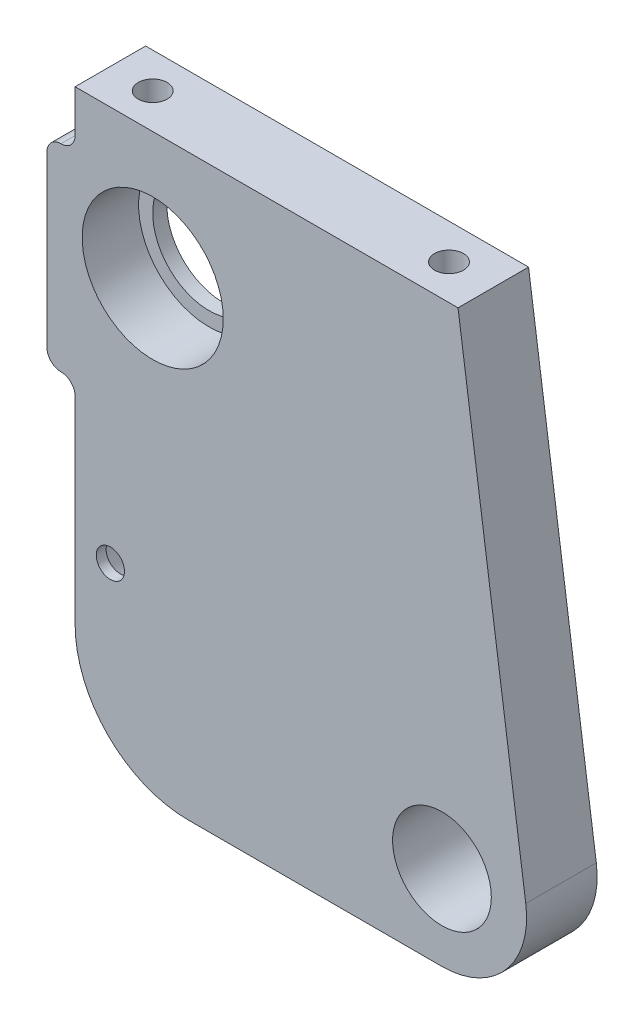
ISO-10303-21;
HEADER;
FILE_DESCRIPTION(('STEP AP214'),'2;1');
FILE_NAME('part.step','',(''),(''),'','','');
FILE_SCHEMA(('AUTOMOTIVE_DESIGN { 1 0 10303 214 1 1 1 1 }'));
ENDSEC;
DATA;
#1=APPLICATION_CONTEXT('core data for automotive mechanical design processes');
#2=APPLICATION_PROTOCOL_DEFINITION('international standard','automotive_design',2000,#1);
#3=PRODUCT_CONTEXT('',#1,'mechanical');
#4=PRODUCT('Part','Part','',(#3));
#5=PRODUCT_RELATED_PRODUCT_CATEGORY('part','',(#4));
#6=PRODUCT_DEFINITION_FORMATION('','',#4);
#7=PRODUCT_DEFINITION_CONTEXT('part definition',#1,'design');
#8=PRODUCT_DEFINITION('design','',#6,#7);
#9=PRODUCT_DEFINITION_SHAPE('','',#8);
#10=(LENGTH_UNIT() NAMED_UNIT(*) SI_UNIT(.MILLI.,.METRE.));
#11=(NAMED_UNIT(*) PLANE_ANGLE_UNIT() SI_UNIT($,.RADIAN.));
#12=(NAMED_UNIT(*) SI_UNIT($,.STERADIAN.) SOLID_ANGLE_UNIT());
#13=UNCERTAINTY_MEASURE_WITH_UNIT(LENGTH_MEASURE(1.E-05),#10,'distance_accuracy_value','');
#14=(GEOMETRIC_REPRESENTATION_CONTEXT(3) GLOBAL_UNCERTAINTY_ASSIGNED_CONTEXT((#13)) GLOBAL_UNIT_ASSIGNED_CONTEXT((#10,
#11,#12)) REPRESENTATION_CONTEXT('',''));
#15=CARTESIAN_POINT('',(0.,0.,0.));
#16=DIRECTION('',(0.,0.,1.));
#17=DIRECTION('',(1.,0.,0.));
#18=AXIS2_PLACEMENT_3D('',#15,#16,#17);
#19=CARTESIAN_POINT('',(-0.999999999999999,-17.,0.));
#20=DIRECTION('',(0.,0.,-1.));
#21=DIRECTION('',(-1.,0.,0.));
#22=AXIS2_PLACEMENT_3D('',#19,#20,#21);
#23=CYLINDRICAL_SURFACE('',#22,1.);
#24=DIRECTION('',(0.,0.,1.));
#25=VECTOR('',#24,1.);
#26=CARTESIAN_POINT('',(-0.999999999999998,-18.,0.));
#27=LINE('',#26,#25);
#28=CARTESIAN_POINT('',(-0.999999999999998,-18.,0.));
#29=VERTEX_POINT('',#28);
#30=CARTESIAN_POINT('',(-0.999999999999998,-18.,5.));
#31=VERTEX_POINT('',#30);
#32=EDGE_CURVE('E323',#29,#31,#27,.T.);
#33=ORIENTED_EDGE('',*,*,#32,.T.);
#34=CARTESIAN_POINT('',(-0.999999999999999,-17.,5.));
#35=DIRECTION('',(0.,0.,1.));
#36=DIRECTION('',(1.,0.,0.));
#37=AXIS2_PLACEMENT_3D('',#34,#35,#36);
#38=CIRCLE('',#37,1.);
#39=CARTESIAN_POINT('',(-2.,-17.,5.));
#40=VERTEX_POINT('',#39);
#41=EDGE_CURVE('E44',#40,#31,#38,.T.);
#42=ORIENTED_EDGE('',*,*,#41,.F.);
#43=DIRECTION('',(0.,0.,-1.));
#44=VECTOR('',#43,1.);
#45=CARTESIAN_POINT('',(-2.,-17.,0.));
#46=LINE('',#45,#44);
#47=CARTESIAN_POINT('',(-2.,-17.,0.));
#48=VERTEX_POINT('',#47);
#49=EDGE_CURVE('E346',#48,#40,#46,.F.);
#50=ORIENTED_EDGE('',*,*,#49,.F.);
#51=CARTESIAN_POINT('',(-0.999999999999999,-17.,0.));
#52=DIRECTION('',(0.,0.,1.));
#53=DIRECTION('',(1.,0.,0.));
#54=AXIS2_PLACEMENT_3D('',#51,#52,#53);
#55=CIRCLE('',#54,1.);
#56=EDGE_CURVE('E11',#29,#48,#55,.F.);
#57=ORIENTED_EDGE('',*,*,#56,.F.);
#58=EDGE_LOOP('',(#33,#42,#50,#57));
#59=FACE_BOUND('',#58,.T.);
#60=ADVANCED_FACE('F37',(#59),#23,.T.);
#61=CARTESIAN_POINT('',(-1.,-5.,0.));
#62=DIRECTION('',(0.,0.,1.));
#63=DIRECTION('',(1.,0.,0.));
#64=AXIS2_PLACEMENT_3D('',#61,#62,#63);
#65=CYLINDRICAL_SURFACE('',#64,1.);
#66=DIRECTION('',(0.,0.,1.));
#67=VECTOR('',#66,1.);
#68=CARTESIAN_POINT('',(-1.,-4.,0.));
#69=LINE('',#68,#67);
#70=CARTESIAN_POINT('',(-1.,-4.,5.));
#71=VERTEX_POINT('',#70);
#72=CARTESIAN_POINT('',(-1.,-4.,0.));
#73=VERTEX_POINT('',#72);
#74=EDGE_CURVE('E391',#71,#73,#69,.F.);
#75=ORIENTED_EDGE('',*,*,#74,.T.);
#76=CARTESIAN_POINT('',(-1.,-5.,0.));
#77=DIRECTION('',(0.,0.,1.));
#78=DIRECTION('',(1.,0.,0.));
#79=AXIS2_PLACEMENT_3D('',#76,#77,#78);
#80=CIRCLE('',#79,1.);
#81=CARTESIAN_POINT('',(-2.,-5.,0.));
#82=VERTEX_POINT('',#81);
#83=EDGE_CURVE('E342',#82,#73,#80,.F.);
#84=ORIENTED_EDGE('',*,*,#83,.F.);
#85=DIRECTION('',(0.,0.,1.));
#86=VECTOR('',#85,1.);
#87=CARTESIAN_POINT('',(-2.,-5.,0.));
#88=LINE('',#87,#86);
#89=CARTESIAN_POINT('',(-2.,-5.,5.));
#90=VERTEX_POINT('',#89);
#91=EDGE_CURVE('E339',#90,#82,#88,.F.);
#92=ORIENTED_EDGE('',*,*,#91,.F.);
#93=CARTESIAN_POINT('',(-1.,-5.,5.));
#94=DIRECTION('',(0.,0.,1.));
#95=DIRECTION('',(1.,0.,0.));
#96=AXIS2_PLACEMENT_3D('',#93,#94,#95);
#97=CIRCLE('',#96,1.);
#98=EDGE_CURVE('E344',#71,#90,#97,.T.);
#99=ORIENTED_EDGE('',*,*,#98,.F.);
#100=EDGE_LOOP('',(#75,#84,#92,#99));
#101=FACE_BOUND('',#100,.T.);
#102=ADVANCED_FACE('F316',(#101),#65,.T.);
#103=CARTESIAN_POINT('',(-0.999999999999998,-19.,0.));
#104=DIRECTION('',(0.,0.,1.));
#105=DIRECTION('',(1.,0.,0.));
#106=AXIS2_PLACEMENT_3D('',#103,#104,#105);
#107=CYLINDRICAL_SURFACE('',#106,1.);
#108=ORIENTED_EDGE('',*,*,#32,.F.);
#109=CARTESIAN_POINT('',(-0.999999999999998,-19.,0.));
#110=DIRECTION('',(0.,0.,1.));
#111=DIRECTION('',(1.,0.,0.));
#112=AXIS2_PLACEMENT_3D('',#109,#110,#111);
#113=CIRCLE('',#112,1.);
#114=CARTESIAN_POINT('',(0.,-19.,0.));
#115=VERTEX_POINT('',#114);
#116=EDGE_CURVE('E330',#29,#115,#113,.F.);
#117=ORIENTED_EDGE('',*,*,#116,.T.);
#118=DIRECTION('',(0.,0.,1.));
#119=VECTOR('',#118,1.);
#120=CARTESIAN_POINT('',(0.,-19.,5.));
#121=LINE('',#120,#119);
#122=CARTESIAN_POINT('',(0.,-19.,5.));
#123=VERTEX_POINT('',#122);
#124=EDGE_CURVE('E326',#123,#115,#121,.F.);
#125=ORIENTED_EDGE('',*,*,#124,.F.);
#126=CARTESIAN_POINT('',(-0.999999999999998,-19.,5.));
#127=DIRECTION('',(0.,0.,1.));
#128=DIRECTION('',(1.,0.,0.));
#129=AXIS2_PLACEMENT_3D('',#126,#127,#128);
#130=CIRCLE('',#129,1.);
#131=EDGE_CURVE('E337',#123,#31,#130,.T.);
#132=ORIENTED_EDGE('',*,*,#131,.T.);
#133=EDGE_LOOP('',(#108,#117,#125,#132));
#134=FACE_BOUND('',#133,.T.);
#135=ADVANCED_FACE('F320',(#134),#107,.F.);
#136=CARTESIAN_POINT('',(-1.,-3.,5.));
#137=DIRECTION('',(0.,0.,1.));
#138=DIRECTION('',(1.,0.,0.));
#139=AXIS2_PLACEMENT_3D('',#136,#137,#138);
#140=CYLINDRICAL_SURFACE('',#139,1.);
#141=DIRECTION('',(0.,0.,1.));
#142=VECTOR('',#141,1.);
#143=CARTESIAN_POINT('',(0.,-3.,5.));
#144=LINE('',#143,#142);
#145=CARTESIAN_POINT('',(0.,-3.,0.));
#146=VERTEX_POINT('',#145);
#147=CARTESIAN_POINT('',(0.,-3.,5.));
#148=VERTEX_POINT('',#147);
#149=EDGE_CURVE('E272',#146,#148,#144,.T.);
#150=ORIENTED_EDGE('',*,*,#149,.F.);
#151=CARTESIAN_POINT('',(-1.,-3.,0.));
#152=DIRECTION('',(0.,0.,1.));
#153=DIRECTION('',(1.,0.,0.));
#154=AXIS2_PLACEMENT_3D('',#151,#152,#153);
#155=CIRCLE('',#154,1.);
#156=EDGE_CURVE('E332',#146,#73,#155,.F.);
#157=ORIENTED_EDGE('',*,*,#156,.T.);
#158=ORIENTED_EDGE('',*,*,#74,.F.);
#159=CARTESIAN_POINT('',(-1.,-3.,5.));
#160=DIRECTION('',(0.,0.,1.));
#161=DIRECTION('',(1.,0.,0.));
#162=AXIS2_PLACEMENT_3D('',#159,#160,#161);
#163=CIRCLE('',#162,1.);
#164=EDGE_CURVE('E327',#71,#148,#163,.T.);
#165=ORIENTED_EDGE('',*,*,#164,.T.);
#166=EDGE_LOOP('',(#150,#157,#158,#165));
#167=FACE_BOUND('',#166,.T.);
#168=ADVANCED_FACE('F392',(#167),#140,.F.);
#169=CARTESIAN_POINT('',(0.,0.,5.));
#170=DIRECTION('',(1.,0.,0.));
#171=DIRECTION('',(0.,1.,0.));
#172=AXIS2_PLACEMENT_3D('',#169,#170,#171);
#173=PLANE('',#172);
#174=DIRECTION('',(0.,-1.,0.));
#175=VECTOR('',#174,1.);
#176=CARTESIAN_POINT('',(0.,0.,5.));
#177=LINE('',#176,#175);
#178=CARTESIAN_POINT('',(0.,-33.0000000000001,5.));
#179=VERTEX_POINT('',#178);
#180=EDGE_CURVE('E245',#123,#179,#177,.T.);
#181=ORIENTED_EDGE('',*,*,#180,.F.);
#182=ORIENTED_EDGE('',*,*,#124,.T.);
#183=DIRECTION('',(0.,-1.,0.));
#184=VECTOR('',#183,1.);
#185=CARTESIAN_POINT('',(0.,0.,0.));
#186=LINE('',#185,#184);
#187=CARTESIAN_POINT('',(0.,-33.0000000000001,0.));
#188=VERTEX_POINT('',#187);
#189=EDGE_CURVE('E240',#115,#188,#186,.T.);
#190=ORIENTED_EDGE('',*,*,#189,.T.);
#191=DIRECTION('',(0.,0.,-1.));
#192=VECTOR('',#191,1.);
#193=CARTESIAN_POINT('',(0.,-33.0000000000001,5.));
#194=LINE('',#193,#192);
#195=EDGE_CURVE('E267',#188,#179,#194,.F.);
#196=ORIENTED_EDGE('',*,*,#195,.T.);
#197=EDGE_LOOP('',(#181,#182,#190,#196));
#198=FACE_BOUND('',#197,.T.);
#199=ADVANCED_FACE('F357',(#198),#173,.F.);
#200=CARTESIAN_POINT('',(0.,0.,0.));
#201=VERTEX_POINT('',#200);
#202=EDGE_CURVE('E251',#201,#146,#186,.T.);
#203=ORIENTED_EDGE('',*,*,#202,.T.);
#204=ORIENTED_EDGE('',*,*,#149,.T.);
#205=CARTESIAN_POINT('',(0.,0.,5.));
#206=VERTEX_POINT('',#205);
#207=EDGE_CURVE('E241',#206,#148,#177,.T.);
#208=ORIENTED_EDGE('',*,*,#207,.F.);
#209=DIRECTION('',(0.,0.,-1.));
#210=VECTOR('',#209,1.);
#211=CARTESIAN_POINT('',(0.,0.,5.));
#212=LINE('',#211,#210);
#213=EDGE_CURVE('E250',#206,#201,#212,.T.);
#214=ORIENTED_EDGE('',*,*,#213,.T.);
#215=EDGE_LOOP('',(#203,#204,#208,#214));
#216=FACE_BOUND('',#215,.T.);
#217=ADVANCED_FACE('F383',(#216),#173,.F.);
#218=CARTESIAN_POINT('',(2.5,-28.,7.8284271247462));
#219=DIRECTION('',(0.,0.,-1.));
#220=DIRECTION('',(-1.,0.,0.));
#221=AXIS2_PLACEMENT_3D('',#218,#219,#220);
#222=CYLINDRICAL_SURFACE('',#221,1.);
#223=CARTESIAN_POINT('',(2.5,-28.,5.));
#224=DIRECTION('',(0.,0.,1.));
#225=DIRECTION('',(1.,0.,0.));
#226=AXIS2_PLACEMENT_3D('',#223,#224,#225);
#227=CIRCLE('',#226,1.);
#228=CARTESIAN_POINT('',(3.5,-28.,5.));
#229=VERTEX_POINT('',#228);
#230=EDGE_CURVE('E190',#229,#229,#227,.F.);
#231=ORIENTED_EDGE('',*,*,#230,.F.);
#232=EDGE_LOOP('',(#231));
#233=FACE_BOUND('',#232,.T.);
#234=CARTESIAN_POINT('',(2.5,-28.,4.3));
#235=DIRECTION('',(0.,0.,-1.));
#236=DIRECTION('',(-1.,0.,0.));
#237=AXIS2_PLACEMENT_3D('',#234,#235,#236);
#238=CIRCLE('',#237,1.);
#239=CARTESIAN_POINT('',(1.5,-28.,4.3));
#240=VERTEX_POINT('',#239);
#241=EDGE_CURVE('E182',#240,#240,#238,.F.);
#242=ORIENTED_EDGE('',*,*,#241,.F.);
#243=EDGE_LOOP('',(#242));
#244=FACE_BOUND('',#243,.T.);
#245=ADVANCED_FACE('F430',(#233,#244),#222,.F.);
#246=CARTESIAN_POINT('',(5.5,-9.00000000000013,-11.3137084989848));
#247=DIRECTION('',(0.,0.,1.));
#248=DIRECTION('',(1.,0.,0.));
#249=AXIS2_PLACEMENT_3D('',#246,#247,#248);
#250=CYLINDRICAL_SURFACE('',#249,4.);
#251=CARTESIAN_POINT('',(5.5,-9.00000000000013,0.));
#252=DIRECTION('',(0.,0.,1.));
#253=DIRECTION('',(1.,0.,0.));
#254=AXIS2_PLACEMENT_3D('',#251,#252,#253);
#255=CIRCLE('',#254,4.);
#256=CARTESIAN_POINT('',(9.5,-9.00000000000013,0.));
#257=VERTEX_POINT('',#256);
#258=EDGE_CURVE('E231',#257,#257,#255,.F.);
#259=ORIENTED_EDGE('',*,*,#258,.T.);
#260=EDGE_LOOP('',(#259));
#261=FACE_BOUND('',#260,.T.);
#262=CARTESIAN_POINT('',(5.5,-9.00000000000013,1.));
#263=DIRECTION('',(0.,0.,1.));
#264=DIRECTION('',(1.,0.,0.));
#265=AXIS2_PLACEMENT_3D('',#262,#263,#264);
#266=CIRCLE('',#265,4.);
#267=CARTESIAN_POINT('',(9.5,-9.00000000000013,1.));
#268=VERTEX_POINT('',#267);
#269=EDGE_CURVE('E228',#268,#268,#266,.F.);
#270=ORIENTED_EDGE('',*,*,#269,.F.);
#271=EDGE_LOOP('',(#270));
#272=FACE_BOUND('',#271,.T.);
#273=ADVANCED_FACE('F432',(#261,#272),#250,.F.);
#274=CARTESIAN_POINT('',(0.,-41.0000000000001,5.));
#275=DIRECTION('',(0.,1.,0.));
#276=DIRECTION('',(-1.,0.,0.));
#277=AXIS2_PLACEMENT_3D('',#274,#275,#276);
#278=PLANE('',#277);
#279=DIRECTION('',(1.,0.,0.));
#280=VECTOR('',#279,1.);
#281=CARTESIAN_POINT('',(0.,-41.0000000000001,0.));
#282=LINE('',#281,#280);
#283=CARTESIAN_POINT('',(8.00000000000004,-41.0000000000001,0.));
#284=VERTEX_POINT('',#283);
#285=CARTESIAN_POINT('',(26.,-41.0000000000001,0.));
#286=VERTEX_POINT('',#285);
#287=EDGE_CURVE('E254',#284,#286,#282,.T.);
#288=ORIENTED_EDGE('',*,*,#287,.T.);
#289=DIRECTION('',(0.,0.,-1.));
#290=VECTOR('',#289,1.);
#291=CARTESIAN_POINT('',(26.,-41.0000000000001,46.773197148411));
#292=LINE('',#291,#290);
#293=CARTESIAN_POINT('',(26.,-41.0000000000001,5.));
#294=VERTEX_POINT('',#293);
#295=EDGE_CURVE('E199',#294,#286,#292,.T.);
#296=ORIENTED_EDGE('',*,*,#295,.F.);
#297=DIRECTION('',(1.,0.,0.));
#298=VECTOR('',#297,1.);
#299=CARTESIAN_POINT('',(0.,-41.0000000000001,5.));
#300=LINE('',#299,#298);
#301=CARTESIAN_POINT('',(8.00000000000004,-41.0000000000001,5.));
#302=VERTEX_POINT('',#301);
#303=EDGE_CURVE('E244',#302,#294,#300,.T.);
#304=ORIENTED_EDGE('',*,*,#303,.F.);
#305=DIRECTION('',(0.,0.,-1.));
#306=VECTOR('',#305,1.);
#307=CARTESIAN_POINT('',(8.00000000000004,-41.0000000000001,5.));
#308=LINE('',#307,#306);
#309=EDGE_CURVE('E261',#302,#284,#308,.T.);
#310=ORIENTED_EDGE('',*,*,#309,.T.);
#311=EDGE_LOOP('',(#288,#296,#304,#310));
#312=FACE_BOUND('',#311,.T.);
#313=ADVANCED_FACE('F365',(#312),#278,.F.);
#314=CARTESIAN_POINT('',(0.,0.,5.));
#315=DIRECTION('',(0.,-1.,0.));
#316=DIRECTION('',(0.,0.,-1.));
#317=AXIS2_PLACEMENT_3D('',#314,#315,#316);
#318=PLANE('',#317);
#319=CARTESIAN_POINT('',(3.,0.,2.5));
#320=DIRECTION('',(0.,1.,0.));
#321=DIRECTION('',(0.,0.,1.));
#322=AXIS2_PLACEMENT_3D('',#319,#320,#321);
#323=CIRCLE('',#322,1.025);
#324=CARTESIAN_POINT('',(3.,0.,3.525));
#325=VERTEX_POINT('',#324);
#326=EDGE_CURVE('E211',#325,#325,#323,.T.);
#327=ORIENTED_EDGE('',*,*,#326,.F.);
#328=EDGE_LOOP('',(#327));
#329=FACE_BOUND('',#328,.T.);
#330=CARTESIAN_POINT('',(24.,0.,2.5));
#331=DIRECTION('',(0.,1.,0.));
#332=DIRECTION('',(0.,0.,1.));
#333=AXIS2_PLACEMENT_3D('',#330,#331,#332);
#334=CIRCLE('',#333,1.025);
#335=CARTESIAN_POINT('',(24.,0.,3.525));
#336=VERTEX_POINT('',#335);
#337=EDGE_CURVE('E218',#336,#336,#334,.T.);
#338=ORIENTED_EDGE('',*,*,#337,.F.);
#339=EDGE_LOOP('',(#338));
#340=FACE_BOUND('',#339,.T.);
#341=DIRECTION('',(-1.,0.,0.));
#342=VECTOR('',#341,1.);
#343=CARTESIAN_POINT('',(0.,0.,5.));
#344=LINE('',#343,#342);
#345=CARTESIAN_POINT('',(27.140036220528,0.,5.));
#346=VERTEX_POINT('',#345);
#347=EDGE_CURVE('E248',#346,#206,#344,.T.);
#348=ORIENTED_EDGE('',*,*,#347,.F.);
#349=DIRECTION('',(0.,0.,-1.));
#350=VECTOR('',#349,1.);
#351=CARTESIAN_POINT('',(27.140036220528,0.,46.773197148411));
#352=LINE('',#351,#350);
#353=CARTESIAN_POINT('',(27.140036220528,0.,0.));
#354=VERTEX_POINT('',#353);
#355=EDGE_CURVE('E204',#346,#354,#352,.T.);
#356=ORIENTED_EDGE('',*,*,#355,.T.);
#357=DIRECTION('',(-1.,0.,0.));
#358=VECTOR('',#357,1.);
#359=CARTESIAN_POINT('',(0.,0.,0.));
#360=LINE('',#359,#358);
#361=EDGE_CURVE('E257',#354,#201,#360,.T.);
#362=ORIENTED_EDGE('',*,*,#361,.T.);
#363=ORIENTED_EDGE('',*,*,#213,.F.);
#364=EDGE_LOOP('',(#348,#356,#362,#363));
#365=FACE_BOUND('',#364,.T.);
#366=ADVANCED_FACE('F378',(#329,#340,#365),#318,.F.);
#367=CARTESIAN_POINT('',(0.,-41.0000000000001,5.));
#368=DIRECTION('',(0.,0.,1.));
#369=DIRECTION('',(1.,0.,0.));
#370=AXIS2_PLACEMENT_3D('',#367,#368,#369);
#371=PLANE('',#370);
#372=DIRECTION('',(0.,-1.,0.));
#373=VECTOR('',#372,1.);
#374=CARTESIAN_POINT('',(-2.,-4.,5.));
#375=LINE('',#374,#373);
#376=EDGE_CURVE('E353',#90,#40,#375,.T.);
#377=ORIENTED_EDGE('',*,*,#376,.T.);
#378=ORIENTED_EDGE('',*,*,#41,.T.);
#379=ORIENTED_EDGE('',*,*,#131,.F.);
#380=ORIENTED_EDGE('',*,*,#180,.T.);
#381=CARTESIAN_POINT('',(8.,-33.0000000000001,5.));
#382=DIRECTION('',(0.,0.,1.));
#383=DIRECTION('',(1.,0.,0.));
#384=AXIS2_PLACEMENT_3D('',#381,#382,#383);
#385=CIRCLE('',#384,8.);
#386=EDGE_CURVE('E270',#179,#302,#385,.T.);
#387=ORIENTED_EDGE('',*,*,#386,.T.);
#388=ORIENTED_EDGE('',*,*,#303,.T.);
#389=CARTESIAN_POINT('',(26.,-35.0000000000001,5.));
#390=DIRECTION('',(0.,0.,1.));
#391=DIRECTION('',(1.,0.,0.));
#392=AXIS2_PLACEMENT_3D('',#389,#390,#391);
#393=CIRCLE('',#392,6.00000000000001);
#394=CARTESIAN_POINT('',(31.9416084124494,-34.1649613942397,5.));
#395=VERTEX_POINT('',#394);
#396=EDGE_CURVE('E206',#294,#395,#393,.T.);
#397=ORIENTED_EDGE('',*,*,#396,.T.);
#398=DIRECTION('',(-0.139173100960065,0.99026806874157,0.));
#399=VECTOR('',#398,1.);
#400=CARTESIAN_POINT('',(31.9416084124494,-34.1649613942397,5.));
#401=LINE('',#400,#399);
#402=EDGE_CURVE('E201',#395,#346,#401,.T.);
#403=ORIENTED_EDGE('',*,*,#402,.T.);
#404=ORIENTED_EDGE('',*,*,#347,.T.);
#405=ORIENTED_EDGE('',*,*,#207,.T.);
#406=ORIENTED_EDGE('',*,*,#164,.F.);
#407=ORIENTED_EDGE('',*,*,#98,.T.);
#408=EDGE_LOOP('',(#377,#378,#379,#380,#387,#388,#397,#403,#404,#405,#406,#407));
#409=FACE_BOUND('',#408,.T.);
#410=ORIENTED_EDGE('',*,*,#230,.T.);
#411=EDGE_LOOP('',(#410));
#412=FACE_BOUND('',#411,.T.);
#413=CARTESIAN_POINT('',(5.5,-9.00000000000013,5.));
#414=DIRECTION('',(0.,0.,1.));
#415=DIRECTION('',(1.,0.,0.));
#416=AXIS2_PLACEMENT_3D('',#413,#414,#415);
#417=CIRCLE('',#416,5.);
#418=CARTESIAN_POINT('',(10.5,-9.00000000000013,5.));
#419=VERTEX_POINT('',#418);
#420=EDGE_CURVE('E224',#419,#419,#417,.T.);
#421=ORIENTED_EDGE('',*,*,#420,.F.);
#422=EDGE_LOOP('',(#421));
#423=FACE_BOUND('',#422,.T.);
#424=CARTESIAN_POINT('',(26.,-35.0000000000001,5.));
#425=DIRECTION('',(0.,0.,1.));
#426=DIRECTION('',(1.,0.,0.));
#427=AXIS2_PLACEMENT_3D('',#424,#425,#426);
#428=CIRCLE('',#427,3.5);
#429=CARTESIAN_POINT('',(29.5,-35.0000000000001,5.));
#430=VERTEX_POINT('',#429);
#431=EDGE_CURVE('E234',#430,#430,#428,.T.);
#432=ORIENTED_EDGE('',*,*,#431,.F.);
#433=EDGE_LOOP('',(#432));
#434=FACE_BOUND('',#433,.T.);
#435=ADVANCED_FACE('F349',(#409,#412,#423,#434),#371,.T.);
#436=CARTESIAN_POINT('',(0.,-41.0000000000001,0.));
#437=DIRECTION('',(0.,0.,1.));
#438=DIRECTION('',(1.,0.,0.));
#439=AXIS2_PLACEMENT_3D('',#436,#437,#438);
#440=PLANE('',#439);
#441=DIRECTION('',(0.,1.,0.));
#442=VECTOR('',#441,1.);
#443=CARTESIAN_POINT('',(0.49999999999911,-22.1,0.));
#444=LINE('',#443,#442);
#445=CARTESIAN_POINT('',(0.499999999999109,-31.099737485718,0.));
#446=VERTEX_POINT('',#445);
#447=CARTESIAN_POINT('',(0.49999999999911,-22.1,0.));
#448=VERTEX_POINT('',#447);
#449=EDGE_CURVE('E166',#446,#448,#444,.T.);
#450=ORIENTED_EDGE('',*,*,#449,.F.);
#451=DIRECTION('',(-1.,0.,0.));
#452=VECTOR('',#451,1.);
#453=CARTESIAN_POINT('',(7.09999999999916,-31.099737485718,0.));
#454=LINE('',#453,#452);
#455=CARTESIAN_POINT('',(7.49999999999919,-31.099737485718,0.));
#456=VERTEX_POINT('',#455);
#457=EDGE_CURVE('E160',#456,#446,#454,.T.);
#458=ORIENTED_EDGE('',*,*,#457,.F.);
#459=DIRECTION('',(0.,-1.,0.));
#460=VECTOR('',#459,1.);
#461=CARTESIAN_POINT('',(7.49999999999919,-31.099737485718,0.));
#462=LINE('',#461,#460);
#463=CARTESIAN_POINT('',(7.4999999999991,-22.1,0.));
#464=VERTEX_POINT('',#463);
#465=EDGE_CURVE('E184',#464,#456,#462,.T.);
#466=ORIENTED_EDGE('',*,*,#465,.F.);
#467=DIRECTION('',(1.,0.,0.));
#468=VECTOR('',#467,1.);
#469=CARTESIAN_POINT('',(7.4999999999991,-22.1,0.));
#470=LINE('',#469,#468);
#471=EDGE_CURVE('E181',#448,#464,#470,.T.);
#472=ORIENTED_EDGE('',*,*,#471,.F.);
#473=EDGE_LOOP('',(#450,#458,#466,#472));
#474=FACE_BOUND('',#473,.T.);
#475=ORIENTED_EDGE('',*,*,#258,.F.);
#476=EDGE_LOOP('',(#475));
#477=FACE_BOUND('',#476,.T.);
#478=CARTESIAN_POINT('',(26.,-35.0000000000001,0.));
#479=DIRECTION('',(0.,0.,1.));
#480=DIRECTION('',(1.,0.,0.));
#481=AXIS2_PLACEMENT_3D('',#478,#479,#480);
#482=CIRCLE('',#481,3.5);
#483=CARTESIAN_POINT('',(29.5,-35.0000000000001,0.));
#484=VERTEX_POINT('',#483);
#485=EDGE_CURVE('E237',#484,#484,#482,.F.);
#486=ORIENTED_EDGE('',*,*,#485,.F.);
#487=EDGE_LOOP('',(#486));
#488=FACE_BOUND('',#487,.T.);
#489=ORIENTED_EDGE('',*,*,#116,.F.);
#490=ORIENTED_EDGE('',*,*,#56,.T.);
#491=DIRECTION('',(0.,-1.,0.));
#492=VECTOR('',#491,1.);
#493=CARTESIAN_POINT('',(-2.,-4.,0.));
#494=LINE('',#493,#492);
#495=EDGE_CURVE('E397',#82,#48,#494,.T.);
#496=ORIENTED_EDGE('',*,*,#495,.F.);
#497=ORIENTED_EDGE('',*,*,#83,.T.);
#498=ORIENTED_EDGE('',*,*,#156,.F.);
#499=ORIENTED_EDGE('',*,*,#202,.F.);
#500=ORIENTED_EDGE('',*,*,#361,.F.);
#501=DIRECTION('',(-0.139173100960065,0.99026806874157,0.));
#502=VECTOR('',#501,1.);
#503=CARTESIAN_POINT('',(31.9416084124494,-34.1649613942397,0.));
#504=LINE('',#503,#502);
#505=CARTESIAN_POINT('',(31.9416084124494,-34.1649613942397,0.));
#506=VERTEX_POINT('',#505);
#507=EDGE_CURVE('E197',#506,#354,#504,.T.);
#508=ORIENTED_EDGE('',*,*,#507,.F.);
#509=CARTESIAN_POINT('',(26.,-35.0000000000001,0.));
#510=DIRECTION('',(0.,0.,1.));
#511=DIRECTION('',(-1.,0.,0.));
#512=AXIS2_PLACEMENT_3D('',#509,#510,#511);
#513=CIRCLE('',#512,6.00000000000001);
#514=EDGE_CURVE('E196',#286,#506,#513,.T.);
#515=ORIENTED_EDGE('',*,*,#514,.F.);
#516=ORIENTED_EDGE('',*,*,#287,.F.);
#517=CARTESIAN_POINT('',(8.,-33.0000000000001,0.));
#518=DIRECTION('',(0.,0.,1.));
#519=DIRECTION('',(1.,0.,0.));
#520=AXIS2_PLACEMENT_3D('',#517,#518,#519);
#521=CIRCLE('',#520,8.);
#522=EDGE_CURVE('E264',#284,#188,#521,.F.);
#523=ORIENTED_EDGE('',*,*,#522,.T.);
#524=ORIENTED_EDGE('',*,*,#189,.F.);
#525=EDGE_LOOP('',(#489,#490,#496,#497,#498,#499,#500,#508,#515,#516,#523,#524));
#526=FACE_BOUND('',#525,.T.);
#527=ADVANCED_FACE('F367',(#474,#477,#488,#526),#440,.F.);
#528=CARTESIAN_POINT('',(8.,-33.0000000000001,5.));
#529=DIRECTION('',(0.,0.,-1.));
#530=DIRECTION('',(-1.,0.,0.));
#531=AXIS2_PLACEMENT_3D('',#528,#529,#530);
#532=CYLINDRICAL_SURFACE('',#531,8.);
#533=ORIENTED_EDGE('',*,*,#386,.F.);
#534=ORIENTED_EDGE('',*,*,#195,.F.);
#535=ORIENTED_EDGE('',*,*,#522,.F.);
#536=ORIENTED_EDGE('',*,*,#309,.F.);
#537=EDGE_LOOP('',(#533,#534,#535,#536));
#538=FACE_BOUND('',#537,.T.);
#539=ADVANCED_FACE('F311',(#538),#532,.T.);
#540=CARTESIAN_POINT('',(26.,-35.0000000000001,-9.89949493661167));
#541=DIRECTION('',(0.,0.,1.));
#542=DIRECTION('',(1.,0.,0.));
#543=AXIS2_PLACEMENT_3D('',#540,#541,#542);
#544=CYLINDRICAL_SURFACE('',#543,3.5);
#545=ORIENTED_EDGE('',*,*,#485,.T.);
#546=EDGE_LOOP('',(#545));
#547=FACE_BOUND('',#546,.T.);
#548=ORIENTED_EDGE('',*,*,#431,.T.);
#549=EDGE_LOOP('',(#548));
#550=FACE_BOUND('',#549,.T.);
#551=ADVANCED_FACE('F304',(#547,#550),#544,.F.);
#552=CARTESIAN_POINT('',(5.5,-9.00000000000013,1.));
#553=DIRECTION('',(0.,0.,1.));
#554=DIRECTION('',(1.,0.,0.));
#555=AXIS2_PLACEMENT_3D('',#552,#553,#554);
#556=PLANE('',#555);
#557=CARTESIAN_POINT('',(5.5,-9.00000000000013,1.));
#558=DIRECTION('',(0.,0.,1.));
#559=DIRECTION('',(1.,0.,0.));
#560=AXIS2_PLACEMENT_3D('',#557,#558,#559);
#561=CIRCLE('',#560,5.);
#562=CARTESIAN_POINT('',(10.5,-9.00000000000013,1.));
#563=VERTEX_POINT('',#562);
#564=EDGE_CURVE('E225',#563,#563,#561,.T.);
#565=ORIENTED_EDGE('',*,*,#564,.T.);
#566=EDGE_LOOP('',(#565));
#567=FACE_BOUND('',#566,.T.);
#568=ORIENTED_EDGE('',*,*,#269,.T.);
#569=EDGE_LOOP('',(#568));
#570=FACE_BOUND('',#569,.T.);
#571=ADVANCED_FACE('F302',(#567,#570),#556,.T.);
#572=CARTESIAN_POINT('',(5.5,-9.00000000000013,1.));
#573=DIRECTION('',(0.,0.,1.));
#574=DIRECTION('',(1.,0.,0.));
#575=AXIS2_PLACEMENT_3D('',#572,#573,#574);
#576=CYLINDRICAL_SURFACE('',#575,5.);
#577=CARTESIAN_POINT('',(3.,-4.66987298107794,3.525));
#578=CARTESIAN_POINT('',(3.05862842312614,-4.63602713012219,3.52499726263906));
#579=CARTESIAN_POINT('',(3.11803416960404,-4.6033291743399,3.51995880752602));
#580=CARTESIAN_POINT('',(3.23674479733095,-4.54105556733164,3.49910828092649));
#581=CARTESIAN_POINT('',(3.29604925069393,-4.51148618067202,3.4832750488682));
#582=CARTESIAN_POINT('',(3.41269533731451,-4.45606525696237,3.44031044380091));
#583=CARTESIAN_POINT('',(3.47002663310431,-4.43023153295604,3.41312719613777));
#584=CARTESIAN_POINT('',(3.57990690861375,-4.38298584319356,3.34759412606573));
#585=CARTESIAN_POINT('',(3.63246070345389,-4.36156939711291,3.3092557141608));
#586=CARTESIAN_POINT('',(3.72537244577349,-4.32528691672362,3.22659272636324));
#587=CARTESIAN_POINT('',(3.76642287950783,-4.30998206525006,3.18323788301164));
#588=CARTESIAN_POINT('',(3.84078559390394,-4.28316055997332,3.08931110465425));
#589=CARTESIAN_POINT('',(3.87410044909567,-4.27164264528181,3.03874157988732));
#590=CARTESIAN_POINT('',(3.92944734815511,-4.2529841514368,2.93580117023767));
#591=CARTESIAN_POINT('',(3.95211535192408,-4.24558966255847,2.8838169873901));
#592=CARTESIAN_POINT('',(3.98862296638636,-4.23385793922189,2.77651230975277));
#593=CARTESIAN_POINT('',(4.00246436933311,-4.22952008409116,2.72119249476629));
#594=CARTESIAN_POINT('',(4.02054083906114,-4.22388355645146,2.61039792928099));
#595=CARTESIAN_POINT('',(4.02502514326714,-4.22250600200807,2.55496767484027));
#596=CARTESIAN_POINT('',(4.0249746505427,-4.22252153394452,2.44411283348654));
#597=CARTESIAN_POINT('',(4.02044040669371,-4.22391445041939,2.38868824643444));
#598=CARTESIAN_POINT('',(4.00257313447538,-4.22948659248125,2.27977544223498));
#599=CARTESIAN_POINT('',(3.9892946102308,-4.23364855989663,2.22627738155619));
#600=CARTESIAN_POINT('',(3.95447237213362,-4.24482636542985,2.12236256572465));
#601=CARTESIAN_POINT('',(3.93292889225474,-4.2518421227597,2.07194572339211));
#602=CARTESIAN_POINT('',(3.88223105643019,-4.26887552941283,1.97532428674937));
#603=CARTESIAN_POINT('',(3.85303913531411,-4.27890803237649,1.92914204559325));
#604=CARTESIAN_POINT('',(3.78816531893596,-4.30204252049346,1.84246553362818));
#605=CARTESIAN_POINT('',(3.75248321302552,-4.31514460527849,1.80197144751217));
#606=CARTESIAN_POINT('',(3.67504973265751,-4.34475476455965,1.72675322404664));
#607=CARTESIAN_POINT('',(3.63318108264912,-4.36133207248337,1.69217734489384));
#608=CARTESIAN_POINT('',(3.54546896105869,-4.39760280958116,1.63053792208927));
#609=CARTESIAN_POINT('',(3.499624765182,-4.41729680711845,1.60347575113042));
#610=CARTESIAN_POINT('',(3.40280283807754,-4.46075667699257,1.55583607794344));
#611=CARTESIAN_POINT('',(3.35168140156598,-4.48468815615586,1.53570324575169));
#612=CARTESIAN_POINT('',(3.24821020730876,-4.53538722554871,1.5040340011579));
#613=CARTESIAN_POINT('',(3.19585996437919,-4.56215595122131,1.49250104530526));
#614=CARTESIAN_POINT('',(3.08598799311623,-4.62086746536967,1.47695961057217));
#615=CARTESIAN_POINT('',(3.02847677473845,-4.65305981678718,1.47382656833948));
#616=CARTESIAN_POINT('',(2.91498507831851,-4.71957546534328,1.47695322828851));
#617=CARTESIAN_POINT('',(2.8590051475528,-4.75389951037051,1.48321624505666));
#618=CARTESIAN_POINT('',(2.74246874433345,-4.82850069124976,1.50588092511209));
#619=CARTESIAN_POINT('',(2.68227125777869,-4.86896929660917,1.52350145097755));
#620=CARTESIAN_POINT('',(2.56629910531524,-4.95050155400691,1.56918276065806));
#621=CARTESIAN_POINT('',(2.51053102031661,-4.99156598806046,1.59725873901517));
#622=CARTESIAN_POINT('',(2.39932835918812,-5.07683715066162,1.66661568638373));
#623=CARTESIAN_POINT('',(2.34446161716549,-5.12095763568098,1.70892079740678));
#624=CARTESIAN_POINT('',(2.24304874733696,-5.20571344159249,1.80535612183462));
#625=CARTESIAN_POINT('',(2.19648651221234,-5.24635542787309,1.85946298118295));
#626=CARTESIAN_POINT('',(2.12883525286075,-5.307232844691,1.9578981179763));
#627=CARTESIAN_POINT('',(2.10459822229023,-5.32956078430621,1.99877860789132));
#628=CARTESIAN_POINT('',(2.06144821304688,-5.3699543902174,2.0851895417969));
#629=CARTESIAN_POINT('',(2.04252592449876,-5.38802750062743,2.13071166185743));
#630=CARTESIAN_POINT('',(2.01373940063223,-5.4158234860048,2.21777762351225));
#631=CARTESIAN_POINT('',(2.00288768367797,-5.42643892905599,2.25870587327519));
#632=CARTESIAN_POINT('',(1.98626915045228,-5.44277723494151,2.3425338365368));
#633=CARTESIAN_POINT('',(1.98049857930173,-5.44850371054315,2.38543206954377));
#634=CARTESIAN_POINT('',(1.97445343418953,-5.4545040475161,2.47216445409608));
#635=CARTESIAN_POINT('',(1.97419910818669,-5.4547578207374,2.51600146266214));
#636=CARTESIAN_POINT('',(1.97925953955343,-5.44973268590889,2.60303002068457));
#637=CARTESIAN_POINT('',(1.98457558978246,-5.4444524934503,2.64622141793711));
#638=CARTESIAN_POINT('',(1.9999537614986,-5.42931622018915,2.72845556825057));
#639=CARTESIAN_POINT('',(2.00975123141754,-5.41971573028793,2.76759701728881));
#640=CARTESIAN_POINT('',(2.0334360121992,-5.39677842140949,2.84345440371446));
#641=CARTESIAN_POINT('',(2.04732536807064,-5.38343973434998,2.88016911702774));
#642=CARTESIAN_POINT('',(2.0859118232888,-5.34692040937871,2.96719029327104));
#643=CARTESIAN_POINT('',(2.11263257104906,-5.3220458730239,3.01589072739036));
#644=CARTESIAN_POINT('',(2.17215182515039,-5.26810396489403,3.10684498689392));
#645=CARTESIAN_POINT('',(2.20496408927804,-5.23902713577443,3.14908381672488));
#646=CARTESIAN_POINT('',(2.28565385883149,-5.16965441102693,3.2381763520914));
#647=CARTESIAN_POINT('',(2.33515847267988,-5.12852477153401,3.28290746147041));
#648=CARTESIAN_POINT('',(2.44082604007817,-5.04449424974552,3.36156391019618));
#649=CARTESIAN_POINT('',(2.49699647599407,-5.00159141291281,3.39547694582618));
#650=CARTESIAN_POINT('',(2.61537121170639,-4.91535307260614,3.45238922350793));
#651=CARTESIAN_POINT('',(2.67763365473079,-4.87201785273453,3.47526777674777));
#652=CARTESIAN_POINT('',(2.80624051318678,-4.78697764862134,3.50869650458769));
#653=CARTESIAN_POINT('',(2.87257028909683,-4.74526761036672,3.51928844212533));
#654=CARTESIAN_POINT('',(2.95993275624307,-4.69319084676417,3.52441121415135));
#655=CARTESIAN_POINT('',(2.97992079033341,-4.68146459315699,3.52500093749826));
#656=CARTESIAN_POINT('',(3.,-4.66987298107794,3.525));
#657=B_SPLINE_CURVE_WITH_KNOTS('',3,(#577,#578,#579,#580,#581,#582,#583,#584,#585,#586,#587,
#588,#589,#590,#591,#592,#593,#594,#595,#596,#597,#598,#599,#600,#601,#602,#603,#604,#605,#606,
#607,#608,#609,#610,#611,#612,#613,#614,#615,#616,#617,#618,#619,#620,#621,#622,#623,#624,#625,
#626,#627,#628,#629,#630,#631,#632,#633,#634,#635,#636,#637,#638,#639,#640,#641,#642,#643,#644,
#645,#646,#647,#648,#649,#650,#651,#652,#653,#654,#655,#656),.UNSPECIFIED.,.T.,.F.,(4,2,2,2,2,2,
2,2,2,2,2,2,2,2,2,2,2,2,2,2,2,2,2,2,2,2,2,2,2,2,2,2,2,2,2,2,2,2,2,4),(0.,0.203029005919236,
0.406457150182528,0.610825409632835,0.814985353389809,0.998913205559827,1.18277975544069,
1.35351245727374,1.52421048054919,1.69030049092008,1.85638031578536,2.02143462142456,
2.18648425486439,2.35236023847841,2.51824160679936,2.68781010501418,2.85740956165069,
3.03644702758999,3.21555641535061,3.41271615882861,3.60994546941931,3.83296957358191,
4.05631906377666,4.30154794982594,4.54629589406201,4.7033061385701,4.86003960684861,
4.99045395629775,5.12077185071359,5.25156801005756,5.38239453333128,5.50633218442374,
5.63033188142591,5.81191626403767,5.99391586037352,6.22785063044491,6.46205052064306,
6.69875692345848,6.93465636744945,7.0041902515432),.UNSPECIFIED.);
#658=CARTESIAN_POINT('',(3.,-4.66987298107794,3.525));
#659=VERTEX_POINT('',#658);
#660=EDGE_CURVE('E217',#659,#659,#657,.T.);
#661=ORIENTED_EDGE('',*,*,#660,.T.);
#662=EDGE_LOOP('',(#661));
#663=FACE_BOUND('',#662,.T.);
#664=ORIENTED_EDGE('',*,*,#564,.F.);
#665=EDGE_LOOP('',(#664));
#666=FACE_BOUND('',#665,.T.);
#667=ORIENTED_EDGE('',*,*,#420,.T.);
#668=EDGE_LOOP('',(#667));
#669=FACE_BOUND('',#668,.T.);
#670=ADVANCED_FACE('F283',(#663,#666,#669),#576,.F.);
#671=CARTESIAN_POINT('',(24.,-7.35,2.5));
#672=DIRECTION('',(0.,1.,0.));
#673=DIRECTION('',(0.,0.,1.));
#674=AXIS2_PLACEMENT_3D('',#671,#672,#673);
#675=CONICAL_SURFACE('',#674,1.025,1.02974425867665);
#676=CARTESIAN_POINT('',(24.,-7.96588213450325,2.5));
#677=VERTEX_POINT('',#676);
#678=VERTEX_LOOP('',#677);
#679=FACE_BOUND('',#678,.T.);
#680=CARTESIAN_POINT('',(24.,-7.35,2.5));
#681=DIRECTION('',(0.,1.,0.));
#682=DIRECTION('',(0.,0.,1.));
#683=AXIS2_PLACEMENT_3D('',#680,#681,#682);
#684=CIRCLE('',#683,1.025);
#685=CARTESIAN_POINT('',(24.,-7.35,3.525));
#686=VERTEX_POINT('',#685);
#687=EDGE_CURVE('E221',#686,#686,#684,.T.);
#688=ORIENTED_EDGE('',*,*,#687,.T.);
#689=EDGE_LOOP('',(#688));
#690=FACE_BOUND('',#689,.T.);
#691=ADVANCED_FACE('F298',(#679,#690),#675,.F.);
#692=CARTESIAN_POINT('',(24.,0.,2.5));
#693=DIRECTION('',(0.,1.,0.));
#694=DIRECTION('',(0.,0.,1.));
#695=AXIS2_PLACEMENT_3D('',#692,#693,#694);
#696=CYLINDRICAL_SURFACE('',#695,1.025);
#697=ORIENTED_EDGE('',*,*,#687,.F.);
#698=EDGE_LOOP('',(#697));
#699=FACE_BOUND('',#698,.T.);
#700=ORIENTED_EDGE('',*,*,#337,.T.);
#701=EDGE_LOOP('',(#700));
#702=FACE_BOUND('',#701,.T.);
#703=ADVANCED_FACE('F293',(#699,#702),#696,.F.);
#704=CARTESIAN_POINT('',(3.,0.,2.5));
#705=DIRECTION('',(0.,1.,0.));
#706=DIRECTION('',(0.,0.,1.));
#707=AXIS2_PLACEMENT_3D('',#704,#705,#706);
#708=CYLINDRICAL_SURFACE('',#707,1.025);
#709=ORIENTED_EDGE('',*,*,#326,.T.);
#710=EDGE_LOOP('',(#709));
#711=FACE_BOUND('',#710,.T.);
#712=ORIENTED_EDGE('',*,*,#660,.F.);
#713=EDGE_LOOP('',(#712));
#714=FACE_BOUND('',#713,.T.);
#715=ADVANCED_FACE('F287',(#711,#714),#708,.F.);
#716=CARTESIAN_POINT('',(26.,-35.0000000000001,46.773197148411));
#717=DIRECTION('',(0.,0.,-1.));
#718=DIRECTION('',(-1.,0.,0.));
#719=AXIS2_PLACEMENT_3D('',#716,#717,#718);
#720=CYLINDRICAL_SURFACE('',#719,6.00000000000001);
#721=ORIENTED_EDGE('',*,*,#295,.T.);
#722=ORIENTED_EDGE('',*,*,#514,.T.);
#723=DIRECTION('',(0.,0.,-1.));
#724=VECTOR('',#723,1.);
#725=CARTESIAN_POINT('',(31.9416084124494,-34.1649613942397,46.773197148411));
#726=LINE('',#725,#724);
#727=EDGE_CURVE('E205',#395,#506,#726,.T.);
#728=ORIENTED_EDGE('',*,*,#727,.F.);
#729=ORIENTED_EDGE('',*,*,#396,.F.);
#730=EDGE_LOOP('',(#721,#722,#728,#729));
#731=FACE_BOUND('',#730,.T.);
#732=ADVANCED_FACE('F292',(#731),#720,.T.);
#733=CARTESIAN_POINT('',(31.9416084124494,-34.1649613942397,46.773197148411));
#734=DIRECTION('',(-0.99026806874157,-0.139173100960065,0.));
#735=DIRECTION('',(0.139173100960065,-0.99026806874157,0.));
#736=AXIS2_PLACEMENT_3D('',#733,#734,#735);
#737=PLANE('',#736);
#738=ORIENTED_EDGE('',*,*,#727,.T.);
#739=ORIENTED_EDGE('',*,*,#507,.T.);
#740=ORIENTED_EDGE('',*,*,#355,.F.);
#741=ORIENTED_EDGE('',*,*,#402,.F.);
#742=EDGE_LOOP('',(#738,#739,#740,#741));
#743=FACE_BOUND('',#742,.T.);
#744=ADVANCED_FACE('F374',(#743),#737,.F.);
#745=CARTESIAN_POINT('',(0.49999999999917,-31.099737485718,2.5));
#746=DIRECTION('',(0.,0.,-1.));
#747=DIRECTION('',(-1.,0.,0.));
#748=AXIS2_PLACEMENT_3D('',#745,#746,#747);
#749=PLANE('',#748);
#750=CARTESIAN_POINT('',(4.,-28.,2.5));
#751=DIRECTION('',(0.,0.,-1.));
#752=DIRECTION('',(-1.,0.,0.));
#753=AXIS2_PLACEMENT_3D('',#750,#751,#752);
#754=CIRCLE('',#753,3.);
#755=CARTESIAN_POINT('',(0.999999999999999,-28.,2.5));
#756=VERTEX_POINT('',#755);
#757=EDGE_CURVE('E399',#756,#756,#754,.T.);
#758=ORIENTED_EDGE('',*,*,#757,.F.);
#759=EDGE_LOOP('',(#758));
#760=FACE_BOUND('',#759,.T.);
#761=DIRECTION('',(0.,1.,0.));
#762=VECTOR('',#761,1.);
#763=CARTESIAN_POINT('',(0.49999999999916,-30.7,2.5));
#764=LINE('',#763,#762);
#765=CARTESIAN_POINT('',(0.499999999999171,-31.099737485718,2.5));
#766=VERTEX_POINT('',#765);
#767=CARTESIAN_POINT('',(0.49999999999911,-22.1,2.5));
#768=VERTEX_POINT('',#767);
#769=EDGE_CURVE('E149',#766,#768,#764,.T.);
#770=ORIENTED_EDGE('',*,*,#769,.T.);
#771=DIRECTION('',(1.,0.,0.));
#772=VECTOR('',#771,1.);
#773=CARTESIAN_POINT('',(1.90000000000071,-22.1,2.5));
#774=LINE('',#773,#772);
#775=CARTESIAN_POINT('',(7.4999999999991,-22.1,2.5));
#776=VERTEX_POINT('',#775);
#777=EDGE_CURVE('E153',#768,#776,#774,.T.);
#778=ORIENTED_EDGE('',*,*,#777,.T.);
#779=DIRECTION('',(0.,-1.,0.));
#780=VECTOR('',#779,1.);
#781=CARTESIAN_POINT('',(7.49999999999911,-23.5,2.5));
#782=LINE('',#781,#780);
#783=CARTESIAN_POINT('',(7.49999999999919,-31.099737485718,2.5));
#784=VERTEX_POINT('',#783);
#785=EDGE_CURVE('E174',#776,#784,#782,.T.);
#786=ORIENTED_EDGE('',*,*,#785,.T.);
#787=DIRECTION('',(-1.,0.,0.));
#788=VECTOR('',#787,1.);
#789=CARTESIAN_POINT('',(7.09999999999916,-31.099737485718,2.5));
#790=LINE('',#789,#788);
#791=EDGE_CURVE('E156',#784,#766,#790,.T.);
#792=ORIENTED_EDGE('',*,*,#791,.T.);
#793=EDGE_LOOP('',(#770,#778,#786,#792));
#794=FACE_BOUND('',#793,.T.);
#795=ADVANCED_FACE('F151',(#760,#794),#749,.T.);
#796=CARTESIAN_POINT('',(7.09999999999916,-31.099737485718,2.5));
#797=DIRECTION('',(0.,-1.,0.));
#798=DIRECTION('',(0.,0.,-1.));
#799=AXIS2_PLACEMENT_3D('',#796,#797,#798);
#800=PLANE('',#799);
#801=ORIENTED_EDGE('',*,*,#457,.T.);
#802=DIRECTION('',(0.,0.,-1.));
#803=VECTOR('',#802,1.);
#804=CARTESIAN_POINT('',(0.499999999999171,-31.099737485718,2.5));
#805=LINE('',#804,#803);
#806=EDGE_CURVE('E188',#766,#446,#805,.T.);
#807=ORIENTED_EDGE('',*,*,#806,.F.);
#808=ORIENTED_EDGE('',*,*,#791,.F.);
#809=DIRECTION('',(0.,0.,-1.));
#810=VECTOR('',#809,1.);
#811=CARTESIAN_POINT('',(7.49999999999919,-31.099737485718,2.5));
#812=LINE('',#811,#810);
#813=EDGE_CURVE('E191',#784,#456,#812,.T.);
#814=ORIENTED_EDGE('',*,*,#813,.T.);
#815=EDGE_LOOP('',(#801,#807,#808,#814));
#816=FACE_BOUND('',#815,.T.);
#817=ADVANCED_FACE('F410',(#816),#800,.F.);
#818=CARTESIAN_POINT('',(7.49999999999919,-31.099737485718,2.5));
#819=DIRECTION('',(1.,0.,0.));
#820=DIRECTION('',(0.,0.,-1.));
#821=AXIS2_PLACEMENT_3D('',#818,#819,#820);
#822=PLANE('',#821);
#823=ORIENTED_EDGE('',*,*,#465,.T.);
#824=ORIENTED_EDGE('',*,*,#813,.F.);
#825=ORIENTED_EDGE('',*,*,#785,.F.);
#826=DIRECTION('',(0.,0.,-1.));
#827=VECTOR('',#826,1.);
#828=CARTESIAN_POINT('',(7.4999999999991,-22.1,2.5));
#829=LINE('',#828,#827);
#830=EDGE_CURVE('E170',#776,#464,#829,.T.);
#831=ORIENTED_EDGE('',*,*,#830,.T.);
#832=EDGE_LOOP('',(#823,#824,#825,#831));
#833=FACE_BOUND('',#832,.T.);
#834=ADVANCED_FACE('F416',(#833),#822,.F.);
#835=CARTESIAN_POINT('',(7.4999999999991,-22.1,2.5));
#836=DIRECTION('',(0.,1.,0.));
#837=DIRECTION('',(0.,0.,1.));
#838=AXIS2_PLACEMENT_3D('',#835,#836,#837);
#839=PLANE('',#838);
#840=ORIENTED_EDGE('',*,*,#471,.T.);
#841=ORIENTED_EDGE('',*,*,#830,.F.);
#842=ORIENTED_EDGE('',*,*,#777,.F.);
#843=DIRECTION('',(0.,0.,-1.));
#844=VECTOR('',#843,1.);
#845=CARTESIAN_POINT('',(0.49999999999911,-22.1,2.5));
#846=LINE('',#845,#844);
#847=EDGE_CURVE('E163',#768,#448,#846,.T.);
#848=ORIENTED_EDGE('',*,*,#847,.T.);
#849=EDGE_LOOP('',(#840,#841,#842,#848));
#850=FACE_BOUND('',#849,.T.);
#851=ADVANCED_FACE('F172',(#850),#839,.F.);
#852=CARTESIAN_POINT('',(0.49999999999911,-22.1,2.5));
#853=DIRECTION('',(-1.,0.,0.));
#854=DIRECTION('',(0.,-1.,0.));
#855=AXIS2_PLACEMENT_3D('',#852,#853,#854);
#856=PLANE('',#855);
#857=ORIENTED_EDGE('',*,*,#449,.T.);
#858=ORIENTED_EDGE('',*,*,#847,.F.);
#859=ORIENTED_EDGE('',*,*,#769,.F.);
#860=ORIENTED_EDGE('',*,*,#806,.T.);
#861=EDGE_LOOP('',(#857,#858,#859,#860));
#862=FACE_BOUND('',#861,.T.);
#863=ADVANCED_FACE('F164',(#862),#856,.F.);
#864=CARTESIAN_POINT('',(4.,-28.,4.3));
#865=DIRECTION('',(0.,0.,-1.));
#866=DIRECTION('',(-1.,0.,0.));
#867=AXIS2_PLACEMENT_3D('',#864,#865,#866);
#868=PLANE('',#867);
#869=CARTESIAN_POINT('',(4.,-28.,4.3));
#870=DIRECTION('',(0.,0.,-1.));
#871=DIRECTION('',(-1.,0.,0.));
#872=AXIS2_PLACEMENT_3D('',#869,#870,#871);
#873=CIRCLE('',#872,3.);
#874=CARTESIAN_POINT('',(0.999999999999999,-28.,4.3));
#875=VERTEX_POINT('',#874);
#876=EDGE_CURVE('E402',#875,#875,#873,.T.);
#877=ORIENTED_EDGE('',*,*,#876,.T.);
#878=EDGE_LOOP('',(#877));
#879=FACE_BOUND('',#878,.T.);
#880=ORIENTED_EDGE('',*,*,#241,.T.);
#881=EDGE_LOOP('',(#880));
#882=FACE_BOUND('',#881,.T.);
#883=ADVANCED_FACE('F429',(#879,#882),#868,.T.);
#884=CARTESIAN_POINT('',(4.,-28.,4.3));
#885=DIRECTION('',(0.,0.,-1.));
#886=DIRECTION('',(-1.,0.,0.));
#887=AXIS2_PLACEMENT_3D('',#884,#885,#886);
#888=CYLINDRICAL_SURFACE('',#887,3.);
#889=ORIENTED_EDGE('',*,*,#876,.F.);
#890=EDGE_LOOP('',(#889));
#891=FACE_BOUND('',#890,.T.);
#892=ORIENTED_EDGE('',*,*,#757,.T.);
#893=EDGE_LOOP('',(#892));
#894=FACE_BOUND('',#893,.T.);
#895=ADVANCED_FACE('F407',(#891,#894),#888,.F.);
#896=CARTESIAN_POINT('',(-2.,-4.,0.));
#897=DIRECTION('',(-1.,0.,0.));
#898=DIRECTION('',(0.,-1.,0.));
#899=AXIS2_PLACEMENT_3D('',#896,#897,#898);
#900=PLANE('',#899);
#901=ORIENTED_EDGE('',*,*,#495,.T.);
#902=ORIENTED_EDGE('',*,*,#49,.T.);
#903=ORIENTED_EDGE('',*,*,#376,.F.);
#904=ORIENTED_EDGE('',*,*,#91,.T.);
#905=EDGE_LOOP('',(#901,#902,#903,#904));
#906=FACE_BOUND('',#905,.T.);
#907=ADVANCED_FACE('F396',(#906),#900,.T.);
#908=CLOSED_SHELL('',(#60,#102,#135,#168,#199,#217,#245,#273,#313,#366,#435,#527,#539,#551,#571,
#670,#691,#703,#715,#732,#744,#795,#817,#834,#851,#863,#883,#895,#907));
#909=MANIFOLD_SOLID_BREP('B2',#908);
#910=ADVANCED_BREP_SHAPE_REPRESENTATION('',(#18,#909),#14);
#911=SHAPE_DEFINITION_REPRESENTATION(#9,#910);
ENDSEC;
END-ISO-10303-21;
